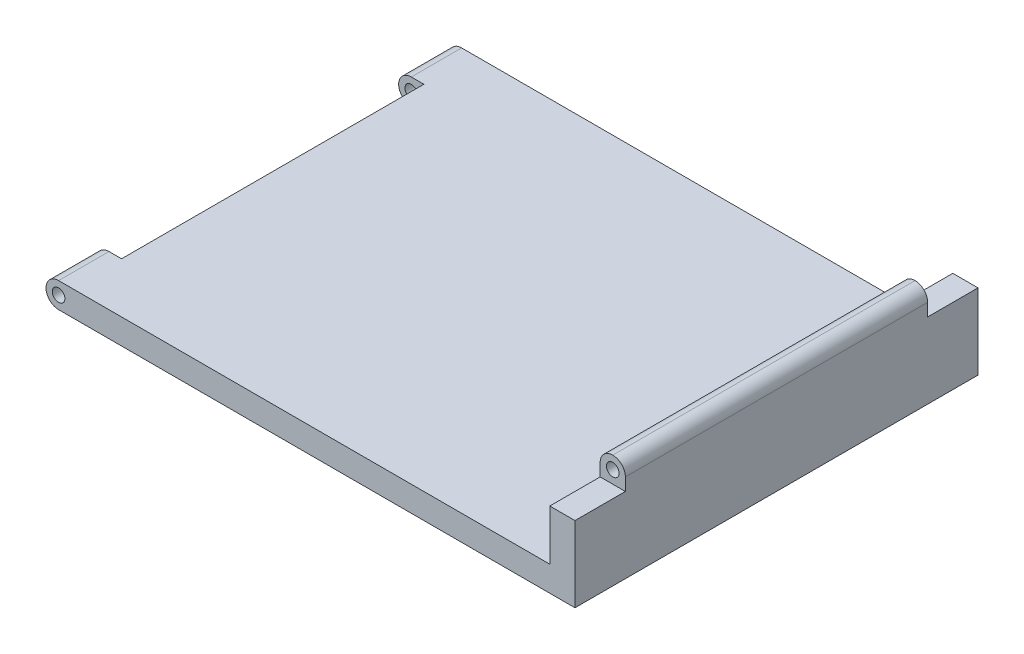
ISO-10303-21;
HEADER;
FILE_DESCRIPTION(('STEP AP214'),'2;1');
FILE_NAME('part.step','',(''),(''),'','','');
FILE_SCHEMA(('AUTOMOTIVE_DESIGN { 1 0 10303 214 1 1 1 1 }'));
ENDSEC;
DATA;
#1=APPLICATION_CONTEXT('core data for automotive mechanical design processes');
#2=APPLICATION_PROTOCOL_DEFINITION('international standard','automotive_design',2000,#1);
#3=PRODUCT_CONTEXT('',#1,'mechanical');
#4=PRODUCT('Part','Part','',(#3));
#5=PRODUCT_RELATED_PRODUCT_CATEGORY('part','',(#4));
#6=PRODUCT_DEFINITION_FORMATION('','',#4);
#7=PRODUCT_DEFINITION_CONTEXT('part definition',#1,'design');
#8=PRODUCT_DEFINITION('design','',#6,#7);
#9=PRODUCT_DEFINITION_SHAPE('','',#8);
#10=(LENGTH_UNIT() NAMED_UNIT(*) SI_UNIT(.MILLI.,.METRE.));
#11=(NAMED_UNIT(*) PLANE_ANGLE_UNIT() SI_UNIT($,.RADIAN.));
#12=(NAMED_UNIT(*) SI_UNIT($,.STERADIAN.) SOLID_ANGLE_UNIT());
#13=UNCERTAINTY_MEASURE_WITH_UNIT(LENGTH_MEASURE(1.E-05),#10,'distance_accuracy_value','');
#14=(GEOMETRIC_REPRESENTATION_CONTEXT(3) GLOBAL_UNCERTAINTY_ASSIGNED_CONTEXT((#13)) GLOBAL_UNIT_ASSIGNED_CONTEXT((#10,
#11,#12)) REPRESENTATION_CONTEXT('',''));
#15=CARTESIAN_POINT('',(0.,0.,0.));
#16=DIRECTION('',(0.,0.,1.));
#17=DIRECTION('',(1.,0.,0.));
#18=AXIS2_PLACEMENT_3D('',#15,#16,#17);
#19=CARTESIAN_POINT('',(100.,0.,40.));
#20=DIRECTION('',(-1.,0.,0.));
#21=DIRECTION('',(0.,0.,1.));
#22=AXIS2_PLACEMENT_3D('',#19,#20,#21);
#23=PLANE('',#22);
#24=DIRECTION('',(0.,1.,0.));
#25=VECTOR('',#24,1.);
#26=CARTESIAN_POINT('',(100.,20.,-30.));
#27=LINE('',#26,#25);
#28=CARTESIAN_POINT('',(100.,15.,-30.));
#29=VERTEX_POINT('',#28);
#30=CARTESIAN_POINT('',(100.,17.5,-30.));
#31=VERTEX_POINT('',#30);
#32=EDGE_CURVE('E263',#29,#31,#27,.T.);
#33=ORIENTED_EDGE('',*,*,#32,.T.);
#34=DIRECTION('',(0.,0.,-1.));
#35=VECTOR('',#34,1.);
#36=CARTESIAN_POINT('',(100.,17.5,40.));
#37=LINE('',#36,#35);
#38=CARTESIAN_POINT('',(100.,17.5,30.));
#39=VERTEX_POINT('',#38);
#40=EDGE_CURVE('E11',#31,#39,#37,.F.);
#41=ORIENTED_EDGE('',*,*,#40,.T.);
#42=DIRECTION('',(0.,1.,0.));
#43=VECTOR('',#42,1.);
#44=CARTESIAN_POINT('',(100.,20.,30.));
#45=LINE('',#44,#43);
#46=CARTESIAN_POINT('',(100.,15.,30.));
#47=VERTEX_POINT('',#46);
#48=EDGE_CURVE('E163',#47,#39,#45,.T.);
#49=ORIENTED_EDGE('',*,*,#48,.F.);
#50=DIRECTION('',(0.,0.,-1.));
#51=VECTOR('',#50,1.);
#52=CARTESIAN_POINT('',(100.,15.,40.));
#53=LINE('',#52,#51);
#54=CARTESIAN_POINT('',(100.,15.,40.));
#55=VERTEX_POINT('',#54);
#56=EDGE_CURVE('E151',#55,#47,#53,.T.);
#57=ORIENTED_EDGE('',*,*,#56,.F.);
#58=DIRECTION('',(0.,1.,0.));
#59=VECTOR('',#58,1.);
#60=CARTESIAN_POINT('',(100.,0.,40.));
#61=LINE('',#60,#59);
#62=CARTESIAN_POINT('',(100.,0.,40.));
#63=VERTEX_POINT('',#62);
#64=EDGE_CURVE('E162',#63,#55,#61,.T.);
#65=ORIENTED_EDGE('',*,*,#64,.F.);
#66=DIRECTION('',(0.,0.,-1.));
#67=VECTOR('',#66,1.);
#68=CARTESIAN_POINT('',(100.,0.,40.));
#69=LINE('',#68,#67);
#70=CARTESIAN_POINT('',(100.,0.,-40.));
#71=VERTEX_POINT('',#70);
#72=EDGE_CURVE('E203',#63,#71,#69,.T.);
#73=ORIENTED_EDGE('',*,*,#72,.T.);
#74=DIRECTION('',(0.,1.,0.));
#75=VECTOR('',#74,1.);
#76=CARTESIAN_POINT('',(100.,0.,-40.));
#77=LINE('',#76,#75);
#78=CARTESIAN_POINT('',(100.,15.,-40.));
#79=VERTEX_POINT('',#78);
#80=EDGE_CURVE('E187',#71,#79,#77,.T.);
#81=ORIENTED_EDGE('',*,*,#80,.T.);
#82=DIRECTION('',(0.,0.,1.));
#83=VECTOR('',#82,1.);
#84=CARTESIAN_POINT('',(100.,15.,-40.));
#85=LINE('',#84,#83);
#86=EDGE_CURVE('E274',#79,#29,#85,.T.);
#87=ORIENTED_EDGE('',*,*,#86,.T.);
#88=EDGE_LOOP('',(#33,#41,#49,#57,#65,#73,#81,#87));
#89=FACE_BOUND('',#88,.T.);
#90=ADVANCED_FACE('F38',(#89),#23,.F.);
#91=CARTESIAN_POINT('',(95.,20.,40.));
#92=DIRECTION('',(1.,0.,0.));
#93=DIRECTION('',(0.,0.,-1.));
#94=AXIS2_PLACEMENT_3D('',#91,#92,#93);
#95=PLANE('',#94);
#96=DIRECTION('',(0.,-1.,0.));
#97=VECTOR('',#96,1.);
#98=CARTESIAN_POINT('',(95.,20.,30.));
#99=LINE('',#98,#97);
#100=CARTESIAN_POINT('',(95.,17.5,30.));
#101=VERTEX_POINT('',#100);
#102=CARTESIAN_POINT('',(95.,15.,30.));
#103=VERTEX_POINT('',#102);
#104=EDGE_CURVE('E231',#101,#103,#99,.T.);
#105=ORIENTED_EDGE('',*,*,#104,.F.);
#106=DIRECTION('',(0.,0.,-1.));
#107=VECTOR('',#106,1.);
#108=CARTESIAN_POINT('',(95.,17.5,40.));
#109=LINE('',#108,#107);
#110=CARTESIAN_POINT('',(95.,17.5,-30.));
#111=VERTEX_POINT('',#110);
#112=EDGE_CURVE('E210',#101,#111,#109,.T.);
#113=ORIENTED_EDGE('',*,*,#112,.T.);
#114=DIRECTION('',(0.,-1.,0.));
#115=VECTOR('',#114,1.);
#116=CARTESIAN_POINT('',(95.,20.,-30.));
#117=LINE('',#116,#115);
#118=CARTESIAN_POINT('',(95.,15.,-30.));
#119=VERTEX_POINT('',#118);
#120=EDGE_CURVE('E245',#111,#119,#117,.T.);
#121=ORIENTED_EDGE('',*,*,#120,.T.);
#122=DIRECTION('',(0.,0.,1.));
#123=VECTOR('',#122,1.);
#124=CARTESIAN_POINT('',(95.,15.,-40.));
#125=LINE('',#124,#123);
#126=CARTESIAN_POINT('',(95.,15.,-40.));
#127=VERTEX_POINT('',#126);
#128=EDGE_CURVE('E270',#127,#119,#125,.T.);
#129=ORIENTED_EDGE('',*,*,#128,.F.);
#130=DIRECTION('',(0.,-1.,0.));
#131=VECTOR('',#130,1.);
#132=CARTESIAN_POINT('',(95.,20.,-40.));
#133=LINE('',#132,#131);
#134=CARTESIAN_POINT('',(95.,5.00000000000001,-40.));
#135=VERTEX_POINT('',#134);
#136=EDGE_CURVE('E192',#127,#135,#133,.T.);
#137=ORIENTED_EDGE('',*,*,#136,.T.);
#138=DIRECTION('',(0.,0.,-1.));
#139=VECTOR('',#138,1.);
#140=CARTESIAN_POINT('',(95.,5.00000000000001,40.));
#141=LINE('',#140,#139);
#142=CARTESIAN_POINT('',(95.,5.00000000000001,40.));
#143=VERTEX_POINT('',#142);
#144=EDGE_CURVE('E199',#143,#135,#141,.T.);
#145=ORIENTED_EDGE('',*,*,#144,.F.);
#146=DIRECTION('',(0.,-1.,0.));
#147=VECTOR('',#146,1.);
#148=CARTESIAN_POINT('',(95.,20.,40.));
#149=LINE('',#148,#147);
#150=CARTESIAN_POINT('',(95.,15.,40.));
#151=VERTEX_POINT('',#150);
#152=EDGE_CURVE('E171',#151,#143,#149,.T.);
#153=ORIENTED_EDGE('',*,*,#152,.F.);
#154=DIRECTION('',(0.,0.,-1.));
#155=VECTOR('',#154,1.);
#156=CARTESIAN_POINT('',(95.,15.,40.));
#157=LINE('',#156,#155);
#158=EDGE_CURVE('E153',#151,#103,#157,.T.);
#159=ORIENTED_EDGE('',*,*,#158,.T.);
#160=EDGE_LOOP('',(#105,#113,#121,#129,#137,#145,#153,#159));
#161=FACE_BOUND('',#160,.T.);
#162=ADVANCED_FACE('F236',(#161),#95,.F.);
#163=CARTESIAN_POINT('',(0.,0.,40.));
#164=DIRECTION('',(0.,0.,1.));
#165=DIRECTION('',(1.,0.,0.));
#166=AXIS2_PLACEMENT_3D('',#163,#164,#165);
#167=PLANE('',#166);
#168=CARTESIAN_POINT('',(-2.5,2.5,40.));
#169=DIRECTION('',(0.,0.,1.));
#170=DIRECTION('',(1.,0.,0.));
#171=AXIS2_PLACEMENT_3D('',#168,#169,#170);
#172=CIRCLE('',#171,1.25);
#173=CARTESIAN_POINT('',(-1.25,2.5,40.));
#174=VERTEX_POINT('',#173);
#175=EDGE_CURVE('E316',#174,#174,#172,.T.);
#176=ORIENTED_EDGE('',*,*,#175,.F.);
#177=EDGE_LOOP('',(#176));
#178=FACE_BOUND('',#177,.T.);
#179=ORIENTED_EDGE('',*,*,#64,.T.);
#180=DIRECTION('',(1.,0.,0.));
#181=VECTOR('',#180,1.);
#182=CARTESIAN_POINT('',(95.,15.,40.));
#183=LINE('',#182,#181);
#184=EDGE_CURVE('E147',#151,#55,#183,.T.);
#185=ORIENTED_EDGE('',*,*,#184,.F.);
#186=ORIENTED_EDGE('',*,*,#152,.T.);
#187=DIRECTION('',(-1.,0.,0.));
#188=VECTOR('',#187,1.);
#189=CARTESIAN_POINT('',(95.,5.00000000000001,40.));
#190=LINE('',#189,#188);
#191=CARTESIAN_POINT('',(-2.5,5.,40.));
#192=VERTEX_POINT('',#191);
#193=EDGE_CURVE('E175',#143,#192,#190,.T.);
#194=ORIENTED_EDGE('',*,*,#193,.T.);
#195=CARTESIAN_POINT('',(-2.5,2.5,40.));
#196=DIRECTION('',(0.,0.,1.));
#197=DIRECTION('',(1.,0.,0.));
#198=AXIS2_PLACEMENT_3D('',#195,#196,#197);
#199=CIRCLE('',#198,2.5);
#200=CARTESIAN_POINT('',(-2.5,0.,40.));
#201=VERTEX_POINT('',#200);
#202=EDGE_CURVE('E333',#192,#201,#199,.T.);
#203=ORIENTED_EDGE('',*,*,#202,.T.);
#204=DIRECTION('',(1.,0.,0.));
#205=VECTOR('',#204,1.);
#206=CARTESIAN_POINT('',(0.,0.,40.));
#207=LINE('',#206,#205);
#208=EDGE_CURVE('E168',#201,#63,#207,.T.);
#209=ORIENTED_EDGE('',*,*,#208,.T.);
#210=EDGE_LOOP('',(#179,#185,#186,#194,#203,#209));
#211=FACE_BOUND('',#210,.T.);
#212=ADVANCED_FACE('F166',(#178,#211),#167,.T.);
#213=CARTESIAN_POINT('',(0.,5.,40.));
#214=DIRECTION('',(1.,0.,0.));
#215=DIRECTION('',(0.,1.,0.));
#216=AXIS2_PLACEMENT_3D('',#213,#214,#215);
#217=PLANE('',#216);
#218=DIRECTION('',(0.,1.,0.));
#219=VECTOR('',#218,1.);
#220=CARTESIAN_POINT('',(0.,0.,-30.));
#221=LINE('',#220,#219);
#222=CARTESIAN_POINT('',(0.,0.,-30.));
#223=VERTEX_POINT('',#222);
#224=CARTESIAN_POINT('',(0.,5.,-30.));
#225=VERTEX_POINT('',#224);
#226=EDGE_CURVE('E286',#223,#225,#221,.T.);
#227=ORIENTED_EDGE('',*,*,#226,.F.);
#228=DIRECTION('',(0.,0.,-1.));
#229=VECTOR('',#228,1.);
#230=CARTESIAN_POINT('',(0.,0.,40.));
#231=LINE('',#230,#229);
#232=CARTESIAN_POINT('',(0.,0.,30.));
#233=VERTEX_POINT('',#232);
#234=EDGE_CURVE('E206',#233,#223,#231,.T.);
#235=ORIENTED_EDGE('',*,*,#234,.F.);
#236=DIRECTION('',(0.,1.,0.));
#237=VECTOR('',#236,1.);
#238=CARTESIAN_POINT('',(0.,0.,30.));
#239=LINE('',#238,#237);
#240=CARTESIAN_POINT('',(0.,5.,30.));
#241=VERTEX_POINT('',#240);
#242=EDGE_CURVE('E320',#233,#241,#239,.T.);
#243=ORIENTED_EDGE('',*,*,#242,.T.);
#244=DIRECTION('',(0.,0.,-1.));
#245=VECTOR('',#244,1.);
#246=CARTESIAN_POINT('',(0.,5.,40.));
#247=LINE('',#246,#245);
#248=EDGE_CURVE('E183',#241,#225,#247,.T.);
#249=ORIENTED_EDGE('',*,*,#248,.T.);
#250=EDGE_LOOP('',(#227,#235,#243,#249));
#251=FACE_BOUND('',#250,.T.);
#252=ADVANCED_FACE('F378',(#251),#217,.F.);
#253=CARTESIAN_POINT('',(0.,0.,40.));
#254=DIRECTION('',(0.,1.,0.));
#255=DIRECTION('',(0.,0.,1.));
#256=AXIS2_PLACEMENT_3D('',#253,#254,#255);
#257=PLANE('',#256);
#258=DIRECTION('',(1.,0.,0.));
#259=VECTOR('',#258,1.);
#260=CARTESIAN_POINT('',(0.,0.,-40.));
#261=LINE('',#260,#259);
#262=CARTESIAN_POINT('',(-2.5,0.,-40.));
#263=VERTEX_POINT('',#262);
#264=EDGE_CURVE('E184',#263,#71,#261,.T.);
#265=ORIENTED_EDGE('',*,*,#264,.T.);
#266=ORIENTED_EDGE('',*,*,#72,.F.);
#267=ORIENTED_EDGE('',*,*,#208,.F.);
#268=DIRECTION('',(0.,0.,-1.));
#269=VECTOR('',#268,1.);
#270=CARTESIAN_POINT('',(-2.5,0.,40.));
#271=LINE('',#270,#269);
#272=CARTESIAN_POINT('',(-2.5,0.,30.));
#273=VERTEX_POINT('',#272);
#274=EDGE_CURVE('E336',#201,#273,#271,.T.);
#275=ORIENTED_EDGE('',*,*,#274,.T.);
#276=DIRECTION('',(1.,0.,0.));
#277=VECTOR('',#276,1.);
#278=CARTESIAN_POINT('',(-2.5,0.,30.));
#279=LINE('',#278,#277);
#280=EDGE_CURVE('E330',#273,#233,#279,.T.);
#281=ORIENTED_EDGE('',*,*,#280,.T.);
#282=ORIENTED_EDGE('',*,*,#234,.T.);
#283=DIRECTION('',(1.,0.,0.));
#284=VECTOR('',#283,1.);
#285=CARTESIAN_POINT('',(-2.5,0.,-30.));
#286=LINE('',#285,#284);
#287=CARTESIAN_POINT('',(-2.5,0.,-30.));
#288=VERTEX_POINT('',#287);
#289=EDGE_CURVE('E290',#288,#223,#286,.T.);
#290=ORIENTED_EDGE('',*,*,#289,.F.);
#291=DIRECTION('',(0.,0.,1.));
#292=VECTOR('',#291,1.);
#293=CARTESIAN_POINT('',(-2.5,0.,-40.));
#294=LINE('',#293,#292);
#295=EDGE_CURVE('E309',#263,#288,#294,.T.);
#296=ORIENTED_EDGE('',*,*,#295,.F.);
#297=EDGE_LOOP('',(#265,#266,#267,#275,#281,#282,#290,#296));
#298=FACE_BOUND('',#297,.T.);
#299=ADVANCED_FACE('F357',(#298),#257,.F.);
#300=CARTESIAN_POINT('',(95.,5.00000000000001,40.));
#301=DIRECTION('',(0.,-1.,0.));
#302=DIRECTION('',(1.,0.,0.));
#303=AXIS2_PLACEMENT_3D('',#300,#301,#302);
#304=PLANE('',#303);
#305=DIRECTION('',(-1.,0.,0.));
#306=VECTOR('',#305,1.);
#307=CARTESIAN_POINT('',(95.,5.00000000000001,-40.));
#308=LINE('',#307,#306);
#309=CARTESIAN_POINT('',(-2.5,5.,-40.));
#310=VERTEX_POINT('',#309);
#311=EDGE_CURVE('E177',#135,#310,#308,.T.);
#312=ORIENTED_EDGE('',*,*,#311,.T.);
#313=DIRECTION('',(0.,0.,1.));
#314=VECTOR('',#313,1.);
#315=CARTESIAN_POINT('',(-2.5,5.,-40.));
#316=LINE('',#315,#314);
#317=CARTESIAN_POINT('',(-2.5,5.,-30.));
#318=VERTEX_POINT('',#317);
#319=EDGE_CURVE('E306',#310,#318,#316,.T.);
#320=ORIENTED_EDGE('',*,*,#319,.T.);
#321=DIRECTION('',(-1.,0.,0.));
#322=VECTOR('',#321,1.);
#323=CARTESIAN_POINT('',(0.,5.,-30.));
#324=LINE('',#323,#322);
#325=EDGE_CURVE('E298',#225,#318,#324,.T.);
#326=ORIENTED_EDGE('',*,*,#325,.F.);
#327=ORIENTED_EDGE('',*,*,#248,.F.);
#328=DIRECTION('',(-1.,0.,0.));
#329=VECTOR('',#328,1.);
#330=CARTESIAN_POINT('',(0.,5.,30.));
#331=LINE('',#330,#329);
#332=CARTESIAN_POINT('',(-2.5,5.,30.));
#333=VERTEX_POINT('',#332);
#334=EDGE_CURVE('E324',#241,#333,#331,.T.);
#335=ORIENTED_EDGE('',*,*,#334,.T.);
#336=DIRECTION('',(0.,0.,-1.));
#337=VECTOR('',#336,1.);
#338=CARTESIAN_POINT('',(-2.5,5.,40.));
#339=LINE('',#338,#337);
#340=EDGE_CURVE('E188',#192,#333,#339,.T.);
#341=ORIENTED_EDGE('',*,*,#340,.F.);
#342=ORIENTED_EDGE('',*,*,#193,.F.);
#343=ORIENTED_EDGE('',*,*,#144,.T.);
#344=EDGE_LOOP('',(#312,#320,#326,#327,#335,#341,#342,#343));
#345=FACE_BOUND('',#344,.T.);
#346=ADVANCED_FACE('F360',(#345),#304,.F.);
#347=CARTESIAN_POINT('',(0.,0.,-40.));
#348=DIRECTION('',(0.,0.,1.));
#349=DIRECTION('',(1.,0.,0.));
#350=AXIS2_PLACEMENT_3D('',#347,#348,#349);
#351=PLANE('',#350);
#352=ORIENTED_EDGE('',*,*,#136,.F.);
#353=DIRECTION('',(1.,0.,0.));
#354=VECTOR('',#353,1.);
#355=CARTESIAN_POINT('',(95.,15.,-40.));
#356=LINE('',#355,#354);
#357=EDGE_CURVE('E266',#127,#79,#356,.T.);
#358=ORIENTED_EDGE('',*,*,#357,.T.);
#359=ORIENTED_EDGE('',*,*,#80,.F.);
#360=ORIENTED_EDGE('',*,*,#264,.F.);
#361=CARTESIAN_POINT('',(-2.5,2.5,-40.));
#362=DIRECTION('',(0.,0.,1.));
#363=DIRECTION('',(1.,0.,0.));
#364=AXIS2_PLACEMENT_3D('',#361,#362,#363);
#365=CIRCLE('',#364,2.5);
#366=EDGE_CURVE('E302',#310,#263,#365,.T.);
#367=ORIENTED_EDGE('',*,*,#366,.F.);
#368=ORIENTED_EDGE('',*,*,#311,.F.);
#369=EDGE_LOOP('',(#352,#358,#359,#360,#367,#368));
#370=FACE_BOUND('',#369,.T.);
#371=CARTESIAN_POINT('',(-2.5,2.5,-40.));
#372=DIRECTION('',(0.,0.,1.));
#373=DIRECTION('',(1.,0.,0.));
#374=AXIS2_PLACEMENT_3D('',#371,#372,#373);
#375=CIRCLE('',#374,1.25);
#376=CARTESIAN_POINT('',(-1.25,2.5,-40.));
#377=VERTEX_POINT('',#376);
#378=EDGE_CURVE('E282',#377,#377,#375,.T.);
#379=ORIENTED_EDGE('',*,*,#378,.T.);
#380=EDGE_LOOP('',(#379));
#381=FACE_BOUND('',#380,.T.);
#382=ADVANCED_FACE('F366',(#370,#381),#351,.F.);
#383=CARTESIAN_POINT('',(-2.5,2.5,30.));
#384=DIRECTION('',(0.,0.,1.));
#385=DIRECTION('',(1.,0.,0.));
#386=AXIS2_PLACEMENT_3D('',#383,#384,#385);
#387=PLANE('',#386);
#388=ORIENTED_EDGE('',*,*,#242,.F.);
#389=ORIENTED_EDGE('',*,*,#280,.F.);
#390=CARTESIAN_POINT('',(-2.5,2.5,30.));
#391=DIRECTION('',(0.,0.,1.));
#392=DIRECTION('',(1.,0.,0.));
#393=AXIS2_PLACEMENT_3D('',#390,#391,#392);
#394=CIRCLE('',#393,2.5);
#395=EDGE_CURVE('E327',#333,#273,#394,.T.);
#396=ORIENTED_EDGE('',*,*,#395,.F.);
#397=ORIENTED_EDGE('',*,*,#334,.F.);
#398=EDGE_LOOP('',(#388,#389,#396,#397));
#399=FACE_BOUND('',#398,.T.);
#400=CARTESIAN_POINT('',(-2.5,2.5,30.));
#401=DIRECTION('',(0.,0.,1.));
#402=DIRECTION('',(1.,0.,0.));
#403=AXIS2_PLACEMENT_3D('',#400,#401,#402);
#404=CIRCLE('',#403,1.25);
#405=CARTESIAN_POINT('',(-1.25,2.5,30.));
#406=VERTEX_POINT('',#405);
#407=EDGE_CURVE('E312',#406,#406,#404,.T.);
#408=ORIENTED_EDGE('',*,*,#407,.T.);
#409=EDGE_LOOP('',(#408));
#410=FACE_BOUND('',#409,.T.);
#411=ADVANCED_FACE('F353',(#399,#410),#387,.F.);
#412=CARTESIAN_POINT('',(-2.5,2.5,40.));
#413=DIRECTION('',(0.,0.,-1.));
#414=DIRECTION('',(-1.,0.,0.));
#415=AXIS2_PLACEMENT_3D('',#412,#413,#414);
#416=CYLINDRICAL_SURFACE('',#415,2.5);
#417=ORIENTED_EDGE('',*,*,#395,.T.);
#418=ORIENTED_EDGE('',*,*,#274,.F.);
#419=ORIENTED_EDGE('',*,*,#202,.F.);
#420=ORIENTED_EDGE('',*,*,#340,.T.);
#421=EDGE_LOOP('',(#417,#418,#419,#420));
#422=FACE_BOUND('',#421,.T.);
#423=ADVANCED_FACE('F346',(#422),#416,.T.);
#424=CARTESIAN_POINT('',(-2.5,2.5,40.));
#425=DIRECTION('',(0.,0.,-1.));
#426=DIRECTION('',(-1.,0.,0.));
#427=AXIS2_PLACEMENT_3D('',#424,#425,#426);
#428=CYLINDRICAL_SURFACE('',#427,1.25);
#429=ORIENTED_EDGE('',*,*,#175,.T.);
#430=EDGE_LOOP('',(#429));
#431=FACE_BOUND('',#430,.T.);
#432=ORIENTED_EDGE('',*,*,#407,.F.);
#433=EDGE_LOOP('',(#432));
#434=FACE_BOUND('',#433,.T.);
#435=ADVANCED_FACE('F402',(#431,#434),#428,.F.);
#436=CARTESIAN_POINT('',(-2.5,2.5,-40.));
#437=DIRECTION('',(0.,0.,1.));
#438=DIRECTION('',(1.,0.,0.));
#439=AXIS2_PLACEMENT_3D('',#436,#437,#438);
#440=CYLINDRICAL_SURFACE('',#439,2.5);
#441=CARTESIAN_POINT('',(-2.5,2.5,-30.));
#442=DIRECTION('',(0.,0.,1.));
#443=DIRECTION('',(1.,0.,0.));
#444=AXIS2_PLACEMENT_3D('',#441,#442,#443);
#445=CIRCLE('',#444,2.5);
#446=EDGE_CURVE('E294',#318,#288,#445,.T.);
#447=ORIENTED_EDGE('',*,*,#446,.F.);
#448=ORIENTED_EDGE('',*,*,#319,.F.);
#449=ORIENTED_EDGE('',*,*,#366,.T.);
#450=ORIENTED_EDGE('',*,*,#295,.T.);
#451=EDGE_LOOP('',(#447,#448,#449,#450));
#452=FACE_BOUND('',#451,.T.);
#453=ADVANCED_FACE('F372',(#452),#440,.T.);
#454=CARTESIAN_POINT('',(-2.5,2.5,-30.));
#455=DIRECTION('',(0.,0.,-1.));
#456=DIRECTION('',(1.,0.,0.));
#457=AXIS2_PLACEMENT_3D('',#454,#455,#456);
#458=PLANE('',#457);
#459=CARTESIAN_POINT('',(-2.5,2.5,-30.));
#460=DIRECTION('',(0.,0.,1.));
#461=DIRECTION('',(1.,0.,0.));
#462=AXIS2_PLACEMENT_3D('',#459,#460,#461);
#463=CIRCLE('',#462,1.25);
#464=CARTESIAN_POINT('',(-1.25,2.5,-30.));
#465=VERTEX_POINT('',#464);
#466=EDGE_CURVE('E278',#465,#465,#463,.T.);
#467=ORIENTED_EDGE('',*,*,#466,.F.);
#468=EDGE_LOOP('',(#467));
#469=FACE_BOUND('',#468,.T.);
#470=ORIENTED_EDGE('',*,*,#226,.T.);
#471=ORIENTED_EDGE('',*,*,#325,.T.);
#472=ORIENTED_EDGE('',*,*,#446,.T.);
#473=ORIENTED_EDGE('',*,*,#289,.T.);
#474=EDGE_LOOP('',(#470,#471,#472,#473));
#475=FACE_BOUND('',#474,.T.);
#476=ADVANCED_FACE('F376',(#469,#475),#458,.F.);
#477=CARTESIAN_POINT('',(-2.5,2.5,-40.));
#478=DIRECTION('',(0.,0.,1.));
#479=DIRECTION('',(1.,0.,0.));
#480=AXIS2_PLACEMENT_3D('',#477,#478,#479);
#481=CYLINDRICAL_SURFACE('',#480,1.25);
#482=ORIENTED_EDGE('',*,*,#378,.F.);
#483=EDGE_LOOP('',(#482));
#484=FACE_BOUND('',#483,.T.);
#485=ORIENTED_EDGE('',*,*,#466,.T.);
#486=EDGE_LOOP('',(#485));
#487=FACE_BOUND('',#486,.T.);
#488=ADVANCED_FACE('F412',(#484,#487),#481,.F.);
#489=CARTESIAN_POINT('',(95.,15.,-40.));
#490=DIRECTION('',(0.,-1.,0.));
#491=DIRECTION('',(0.,0.,-1.));
#492=AXIS2_PLACEMENT_3D('',#489,#490,#491);
#493=PLANE('',#492);
#494=DIRECTION('',(1.,0.,0.));
#495=VECTOR('',#494,1.);
#496=CARTESIAN_POINT('',(95.,15.,-30.));
#497=LINE('',#496,#495);
#498=EDGE_CURVE('E259',#119,#29,#497,.T.);
#499=ORIENTED_EDGE('',*,*,#498,.T.);
#500=ORIENTED_EDGE('',*,*,#86,.F.);
#501=ORIENTED_EDGE('',*,*,#357,.F.);
#502=ORIENTED_EDGE('',*,*,#128,.T.);
#503=EDGE_LOOP('',(#499,#500,#501,#502));
#504=FACE_BOUND('',#503,.T.);
#505=ADVANCED_FACE('F416',(#504),#493,.F.);
#506=CARTESIAN_POINT('',(0.,0.,-30.));
#507=DIRECTION('',(0.,0.,1.));
#508=DIRECTION('',(1.,0.,0.));
#509=AXIS2_PLACEMENT_3D('',#506,#507,#508);
#510=PLANE('',#509);
#511=CARTESIAN_POINT('',(97.5,17.5,-30.));
#512=DIRECTION('',(0.,0.,1.));
#513=DIRECTION('',(1.,0.,0.));
#514=AXIS2_PLACEMENT_3D('',#511,#512,#513);
#515=CIRCLE('',#514,1.25);
#516=CARTESIAN_POINT('',(98.75,17.5,-30.));
#517=VERTEX_POINT('',#516);
#518=EDGE_CURVE('E215',#517,#517,#515,.T.);
#519=ORIENTED_EDGE('',*,*,#518,.T.);
#520=EDGE_LOOP('',(#519));
#521=FACE_BOUND('',#520,.T.);
#522=ORIENTED_EDGE('',*,*,#120,.F.);
#523=CARTESIAN_POINT('',(97.5,17.5,-30.));
#524=DIRECTION('',(0.,0.,1.));
#525=DIRECTION('',(1.,0.,0.));
#526=AXIS2_PLACEMENT_3D('',#523,#524,#525);
#527=CIRCLE('',#526,2.5);
#528=CARTESIAN_POINT('',(97.5,20.,-30.));
#529=VERTEX_POINT('',#528);
#530=EDGE_CURVE('E222',#111,#529,#527,.F.);
#531=ORIENTED_EDGE('',*,*,#530,.T.);
#532=CARTESIAN_POINT('',(97.5,17.5,-30.));
#533=DIRECTION('',(0.,0.,1.));
#534=DIRECTION('',(1.,0.,0.));
#535=AXIS2_PLACEMENT_3D('',#532,#533,#534);
#536=CIRCLE('',#535,2.5);
#537=EDGE_CURVE('E219',#529,#31,#536,.F.);
#538=ORIENTED_EDGE('',*,*,#537,.T.);
#539=ORIENTED_EDGE('',*,*,#32,.F.);
#540=ORIENTED_EDGE('',*,*,#498,.F.);
#541=EDGE_LOOP('',(#522,#531,#538,#539,#540));
#542=FACE_BOUND('',#541,.T.);
#543=ADVANCED_FACE('F243',(#521,#542),#510,.F.);
#544=CARTESIAN_POINT('',(95.,15.,40.));
#545=DIRECTION('',(0.,1.,0.));
#546=DIRECTION('',(0.,0.,1.));
#547=AXIS2_PLACEMENT_3D('',#544,#545,#546);
#548=PLANE('',#547);
#549=DIRECTION('',(1.,0.,0.));
#550=VECTOR('',#549,1.);
#551=CARTESIAN_POINT('',(95.,15.,30.));
#552=LINE('',#551,#550);
#553=EDGE_CURVE('E158',#103,#47,#552,.T.);
#554=ORIENTED_EDGE('',*,*,#553,.F.);
#555=ORIENTED_EDGE('',*,*,#158,.F.);
#556=ORIENTED_EDGE('',*,*,#184,.T.);
#557=ORIENTED_EDGE('',*,*,#56,.T.);
#558=EDGE_LOOP('',(#554,#555,#556,#557));
#559=FACE_BOUND('',#558,.T.);
#560=ADVANCED_FACE('F150',(#559),#548,.T.);
#561=CARTESIAN_POINT('',(0.,0.,30.));
#562=DIRECTION('',(0.,0.,-1.));
#563=DIRECTION('',(1.,0.,0.));
#564=AXIS2_PLACEMENT_3D('',#561,#562,#563);
#565=PLANE('',#564);
#566=CARTESIAN_POINT('',(97.5,17.5,30.));
#567=DIRECTION('',(0.,0.,-1.));
#568=DIRECTION('',(-1.,0.,0.));
#569=AXIS2_PLACEMENT_3D('',#566,#567,#568);
#570=CIRCLE('',#569,1.25);
#571=CARTESIAN_POINT('',(96.25,17.5,30.));
#572=VERTEX_POINT('',#571);
#573=EDGE_CURVE('E211',#572,#572,#570,.T.);
#574=ORIENTED_EDGE('',*,*,#573,.T.);
#575=EDGE_LOOP('',(#574));
#576=FACE_BOUND('',#575,.T.);
#577=CARTESIAN_POINT('',(97.5,17.5,30.));
#578=DIRECTION('',(0.,0.,-1.));
#579=DIRECTION('',(-1.,0.,0.));
#580=AXIS2_PLACEMENT_3D('',#577,#578,#579);
#581=CIRCLE('',#580,2.5);
#582=CARTESIAN_POINT('',(97.5,20.,30.));
#583=VERTEX_POINT('',#582);
#584=EDGE_CURVE('E55',#39,#583,#581,.F.);
#585=ORIENTED_EDGE('',*,*,#584,.T.);
#586=CARTESIAN_POINT('',(97.5,17.5,30.));
#587=DIRECTION('',(0.,0.,-1.));
#588=DIRECTION('',(-1.,0.,0.));
#589=AXIS2_PLACEMENT_3D('',#586,#587,#588);
#590=CIRCLE('',#589,2.5);
#591=EDGE_CURVE('E48',#583,#101,#590,.F.);
#592=ORIENTED_EDGE('',*,*,#591,.T.);
#593=ORIENTED_EDGE('',*,*,#104,.T.);
#594=ORIENTED_EDGE('',*,*,#553,.T.);
#595=ORIENTED_EDGE('',*,*,#48,.T.);
#596=EDGE_LOOP('',(#585,#592,#593,#594,#595));
#597=FACE_BOUND('',#596,.T.);
#598=ADVANCED_FACE('F230',(#576,#597),#565,.F.);
#599=CARTESIAN_POINT('',(97.5,17.5,-40.));
#600=DIRECTION('',(0.,0.,1.));
#601=DIRECTION('',(1.,0.,0.));
#602=AXIS2_PLACEMENT_3D('',#599,#600,#601);
#603=CYLINDRICAL_SURFACE('',#602,1.25);
#604=ORIENTED_EDGE('',*,*,#573,.F.);
#605=EDGE_LOOP('',(#604));
#606=FACE_BOUND('',#605,.T.);
#607=ORIENTED_EDGE('',*,*,#518,.F.);
#608=EDGE_LOOP('',(#607));
#609=FACE_BOUND('',#608,.T.);
#610=ADVANCED_FACE('F428',(#606,#609),#603,.F.);
#611=CARTESIAN_POINT('',(97.5,17.5,40.));
#612=DIRECTION('',(0.,0.,-1.));
#613=DIRECTION('',(-1.,0.,0.));
#614=AXIS2_PLACEMENT_3D('',#611,#612,#613);
#615=CYLINDRICAL_SURFACE('',#614,2.5);
#616=DIRECTION('',(0.,0.,-1.));
#617=VECTOR('',#616,1.);
#618=CARTESIAN_POINT('',(97.5,20.,40.));
#619=LINE('',#618,#617);
#620=EDGE_CURVE('E42',#583,#529,#619,.T.);
#621=ORIENTED_EDGE('',*,*,#620,.F.);
#622=ORIENTED_EDGE('',*,*,#584,.F.);
#623=ORIENTED_EDGE('',*,*,#40,.F.);
#624=ORIENTED_EDGE('',*,*,#537,.F.);
#625=EDGE_LOOP('',(#621,#622,#623,#624));
#626=FACE_BOUND('',#625,.T.);
#627=ADVANCED_FACE('F40',(#626),#615,.T.);
#628=CARTESIAN_POINT('',(97.5,17.5,40.));
#629=DIRECTION('',(0.,0.,-1.));
#630=DIRECTION('',(-1.,0.,0.));
#631=AXIS2_PLACEMENT_3D('',#628,#629,#630);
#632=CYLINDRICAL_SURFACE('',#631,2.5);
#633=ORIENTED_EDGE('',*,*,#591,.F.);
#634=ORIENTED_EDGE('',*,*,#620,.T.);
#635=ORIENTED_EDGE('',*,*,#530,.F.);
#636=ORIENTED_EDGE('',*,*,#112,.F.);
#637=EDGE_LOOP('',(#633,#634,#635,#636));
#638=FACE_BOUND('',#637,.T.);
#639=ADVANCED_FACE('F240',(#638),#632,.T.);
#640=CLOSED_SHELL('',(#90,#162,#212,#252,#299,#346,#382,#411,#423,#435,#453,#476,#488,#505,#543,
#560,#598,#610,#627,#639));
#641=MANIFOLD_SOLID_BREP('B2',#640);
#642=ADVANCED_BREP_SHAPE_REPRESENTATION('',(#18,#641),#14);
#643=SHAPE_DEFINITION_REPRESENTATION(#9,#642);
ENDSEC;
END-ISO-10303-21;
